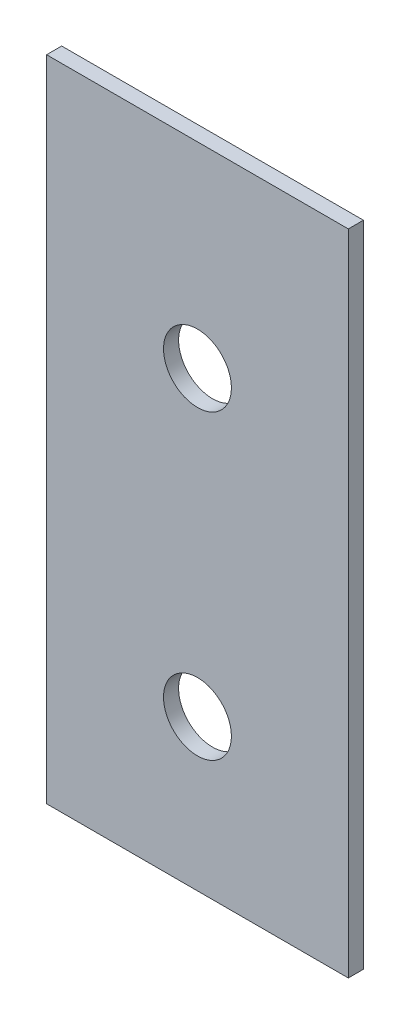
ISO-10303-21;
HEADER;
FILE_DESCRIPTION(('STEP AP214'),'2;1');
FILE_NAME('part.step','',(''),(''),'','','');
FILE_SCHEMA(('AUTOMOTIVE_DESIGN { 1 0 10303 214 1 1 1 1 }'));
ENDSEC;
DATA;
#1=APPLICATION_CONTEXT('core data for automotive mechanical design processes');
#2=APPLICATION_PROTOCOL_DEFINITION('international standard','automotive_design',2000,#1);
#3=PRODUCT_CONTEXT('',#1,'mechanical');
#4=PRODUCT('Part','Part','',(#3));
#5=PRODUCT_RELATED_PRODUCT_CATEGORY('part','',(#4));
#6=PRODUCT_DEFINITION_FORMATION('','',#4);
#7=PRODUCT_DEFINITION_CONTEXT('part definition',#1,'design');
#8=PRODUCT_DEFINITION('design','',#6,#7);
#9=PRODUCT_DEFINITION_SHAPE('','',#8);
#10=(LENGTH_UNIT() NAMED_UNIT(*) SI_UNIT(.MILLI.,.METRE.));
#11=(NAMED_UNIT(*) PLANE_ANGLE_UNIT() SI_UNIT($,.RADIAN.));
#12=(NAMED_UNIT(*) SI_UNIT($,.STERADIAN.) SOLID_ANGLE_UNIT());
#13=UNCERTAINTY_MEASURE_WITH_UNIT(LENGTH_MEASURE(1.E-05),#10,'distance_accuracy_value','');
#14=(GEOMETRIC_REPRESENTATION_CONTEXT(3) GLOBAL_UNCERTAINTY_ASSIGNED_CONTEXT((#13)) GLOBAL_UNIT_ASSIGNED_CONTEXT((#10,
#11,#12)) REPRESENTATION_CONTEXT('',''));
#15=CARTESIAN_POINT('',(0.,0.,0.));
#16=DIRECTION('',(0.,0.,1.));
#17=DIRECTION('',(1.,0.,0.));
#18=AXIS2_PLACEMENT_3D('',#15,#16,#17);
#19=CARTESIAN_POINT('',(6.900791049702E-11,-57.,21.98999999988));
#20=DIRECTION('',(-4.806710585115E-13,0.,-1.));
#21=DIRECTION('',(1.,0.,-4.806710585115E-13));
#22=AXIS2_PLACEMENT_3D('',#19,#20,#21);
#23=CYLINDRICAL_SURFACE('',#22,4.5);
#24=CARTESIAN_POINT('',(1.844000507845E-10,-57.,21.999999999639));
#25=DIRECTION('',(-4.806710585115E-13,0.,-1.));
#26=DIRECTION('',(1.,0.,-4.806710585115E-13));
#27=AXIS2_PLACEMENT_3D('',#24,#25,#26);
#28=CIRCLE('',#27,4.5);
#29=CARTESIAN_POINT('',(4.500000000194,-57.,21.999999999601));
#30=VERTEX_POINT('',#29);
#31=EDGE_CURVE('E80',#30,#30,#28,.T.);
#32=ORIENTED_EDGE('',*,*,#31,.T.);
#33=DIRECTION('',(4.806710585115E-13,0.,1.));
#34=VECTOR('',#33,1.);
#35=CARTESIAN_POINT('',(4.500000000078,-57.,21.989999999842));
#36=LINE('',#35,#34);
#37=CARTESIAN_POINT('',(4.50000000008,-57.,24.000000000007));
#38=VERTEX_POINT('',#37);
#39=EDGE_CURVE('E11',#30,#38,#36,.T.);
#40=ORIENTED_EDGE('',*,*,#39,.T.);
#41=CARTESIAN_POINT('',(7.04858393874E-11,-57.,24.000000000045));
#42=DIRECTION('',(-4.806710585115E-13,0.,-1.));
#43=DIRECTION('',(1.,0.,-4.806710585115E-13));
#44=AXIS2_PLACEMENT_3D('',#41,#42,#43);
#45=CIRCLE('',#44,4.5);
#46=EDGE_CURVE('E78',#38,#38,#45,.T.);
#47=ORIENTED_EDGE('',*,*,#46,.F.);
#48=ORIENTED_EDGE('',*,*,#39,.F.);
#49=EDGE_LOOP('',(#32,#40,#47,#48));
#50=FACE_BOUND('',#49,.T.);
#51=ADVANCED_FACE('F17',(#50),#23,.F.);
#52=CARTESIAN_POINT('',(6.900791049702E-11,-97.,21.98999999988));
#53=DIRECTION('',(-4.806710585115E-13,0.,-1.));
#54=DIRECTION('',(1.,0.,-4.806710585115E-13));
#55=AXIS2_PLACEMENT_3D('',#52,#53,#54);
#56=CYLINDRICAL_SURFACE('',#55,4.5);
#57=CARTESIAN_POINT('',(1.844000507845E-10,-97.,21.999999999639));
#58=DIRECTION('',(-4.806710585115E-13,0.,-1.));
#59=DIRECTION('',(1.,0.,-4.806710585115E-13));
#60=AXIS2_PLACEMENT_3D('',#57,#58,#59);
#61=CIRCLE('',#60,4.5);
#62=CARTESIAN_POINT('',(4.500000000194,-97.,21.999999999601));
#63=VERTEX_POINT('',#62);
#64=EDGE_CURVE('E102',#63,#63,#61,.T.);
#65=ORIENTED_EDGE('',*,*,#64,.T.);
#66=DIRECTION('',(4.806710585115E-13,0.,1.));
#67=VECTOR('',#66,1.);
#68=CARTESIAN_POINT('',(4.500000000078,-97.,21.989999999842));
#69=LINE('',#68,#67);
#70=CARTESIAN_POINT('',(4.50000000008,-97.,24.000000000007));
#71=VERTEX_POINT('',#70);
#72=EDGE_CURVE('E25',#63,#71,#69,.T.);
#73=ORIENTED_EDGE('',*,*,#72,.T.);
#74=CARTESIAN_POINT('',(7.04858393874E-11,-97.,24.000000000045));
#75=DIRECTION('',(-4.806710585115E-13,0.,-1.));
#76=DIRECTION('',(1.,0.,-4.806710585115E-13));
#77=AXIS2_PLACEMENT_3D('',#74,#75,#76);
#78=CIRCLE('',#77,4.5);
#79=EDGE_CURVE('E86',#71,#71,#78,.T.);
#80=ORIENTED_EDGE('',*,*,#79,.F.);
#81=ORIENTED_EDGE('',*,*,#72,.F.);
#82=EDGE_LOOP('',(#65,#73,#80,#81));
#83=FACE_BOUND('',#82,.T.);
#84=ADVANCED_FACE('F178',(#83),#56,.F.);
#85=CARTESIAN_POINT('',(20.000000000093,-117.,21.999999999666));
#86=DIRECTION('',(1.,0.,-4.806710585115E-13));
#87=DIRECTION('',(-4.806710585115E-13,0.,-1.));
#88=AXIS2_PLACEMENT_3D('',#85,#86,#87);
#89=PLANE('',#88);
#90=DIRECTION('',(4.806710585115E-13,0.,1.));
#91=VECTOR('',#90,1.);
#92=CARTESIAN_POINT('',(20.000000000093,-117.,21.999999999666));
#93=LINE('',#92,#91);
#94=CARTESIAN_POINT('',(20.000000000093,-117.,21.999999999666));
#95=VERTEX_POINT('',#94);
#96=CARTESIAN_POINT('',(20.000000000076,-117.,24.000000000098));
#97=VERTEX_POINT('',#96);
#98=EDGE_CURVE('E119',#95,#97,#93,.T.);
#99=ORIENTED_EDGE('',*,*,#98,.F.);
#100=DIRECTION('',(0.,1.,0.));
#101=VECTOR('',#100,1.);
#102=CARTESIAN_POINT('',(20.000000000093,-117.,21.999999999666));
#103=LINE('',#102,#101);
#104=CARTESIAN_POINT('',(20.000000000093,-31.,21.999999999666));
#105=VERTEX_POINT('',#104);
#106=EDGE_CURVE('E101',#95,#105,#103,.T.);
#107=ORIENTED_EDGE('',*,*,#106,.T.);
#108=DIRECTION('',(4.806710585115E-13,0.,1.));
#109=VECTOR('',#108,1.);
#110=CARTESIAN_POINT('',(20.000000000093,-31.,21.999999999666));
#111=LINE('',#110,#109);
#112=CARTESIAN_POINT('',(20.000000000076,-31.,24.000000000098));
#113=VERTEX_POINT('',#112);
#114=EDGE_CURVE('E92',#105,#113,#111,.T.);
#115=ORIENTED_EDGE('',*,*,#114,.T.);
#116=DIRECTION('',(0.,1.,0.));
#117=VECTOR('',#116,1.);
#118=CARTESIAN_POINT('',(20.000000000075,-117.,24.000000000098));
#119=LINE('',#118,#117);
#120=EDGE_CURVE('E115',#97,#113,#119,.T.);
#121=ORIENTED_EDGE('',*,*,#120,.F.);
#122=EDGE_LOOP('',(#99,#107,#115,#121));
#123=FACE_BOUND('',#122,.T.);
#124=ADVANCED_FACE('F147',(#123),#89,.T.);
#125=CARTESIAN_POINT('',(-19.99999999982,-117.,21.999999999585));
#126=DIRECTION('',(4.806710585115E-13,0.,1.));
#127=DIRECTION('',(1.,0.,-4.806710585115E-13));
#128=AXIS2_PLACEMENT_3D('',#125,#126,#127);
#129=PLANE('',#128);
#130=ORIENTED_EDGE('',*,*,#31,.F.);
#131=EDGE_LOOP('',(#130));
#132=FACE_BOUND('',#131,.T.);
#133=ORIENTED_EDGE('',*,*,#64,.F.);
#134=EDGE_LOOP('',(#133));
#135=FACE_BOUND('',#134,.T.);
#136=DIRECTION('',(1.,0.,-4.806710585115E-13));
#137=VECTOR('',#136,1.);
#138=CARTESIAN_POINT('',(-19.99999999982,-31.,21.999999999585));
#139=LINE('',#138,#137);
#140=CARTESIAN_POINT('',(-19.99999999982,-31.,21.999999999585));
#141=VERTEX_POINT('',#140);
#142=EDGE_CURVE('E85',#141,#105,#139,.T.);
#143=ORIENTED_EDGE('',*,*,#142,.T.);
#144=ORIENTED_EDGE('',*,*,#106,.F.);
#145=DIRECTION('',(1.,0.,-4.806710585115E-13));
#146=VECTOR('',#145,1.);
#147=CARTESIAN_POINT('',(-19.99999999982,-117.,21.999999999585));
#148=LINE('',#147,#146);
#149=CARTESIAN_POINT('',(-19.99999999982,-117.,21.999999999585));
#150=VERTEX_POINT('',#149);
#151=EDGE_CURVE('E118',#150,#95,#148,.T.);
#152=ORIENTED_EDGE('',*,*,#151,.F.);
#153=DIRECTION('',(0.,1.,0.));
#154=VECTOR('',#153,1.);
#155=CARTESIAN_POINT('',(-19.99999999982,-117.,21.999999999585));
#156=LINE('',#155,#154);
#157=EDGE_CURVE('E158',#150,#141,#156,.T.);
#158=ORIENTED_EDGE('',*,*,#157,.T.);
#159=EDGE_LOOP('',(#143,#144,#152,#158));
#160=FACE_BOUND('',#159,.T.);
#161=ADVANCED_FACE('F149',(#132,#135,#160),#129,.F.);
#162=CARTESIAN_POINT('',(-19.99999999982,-31.,21.999999999585));
#163=DIRECTION('',(0.,1.,0.));
#164=DIRECTION('',(1.,0.,0.));
#165=AXIS2_PLACEMENT_3D('',#162,#163,#164);
#166=PLANE('',#165);
#167=ORIENTED_EDGE('',*,*,#142,.F.);
#168=DIRECTION('',(4.806710585115E-13,0.,1.));
#169=VECTOR('',#168,1.);
#170=CARTESIAN_POINT('',(-19.99999999982,-31.,21.999999999585));
#171=LINE('',#170,#169);
#172=CARTESIAN_POINT('',(-19.99999999993,-31.,23.99999999999));
#173=VERTEX_POINT('',#172);
#174=EDGE_CURVE('E140',#141,#173,#171,.T.);
#175=ORIENTED_EDGE('',*,*,#174,.T.);
#176=DIRECTION('',(1.,0.,-4.806710585115E-13));
#177=VECTOR('',#176,1.);
#178=CARTESIAN_POINT('',(-19.99999999993,-31.,23.999999999991));
#179=LINE('',#178,#177);
#180=EDGE_CURVE('E96',#173,#113,#179,.T.);
#181=ORIENTED_EDGE('',*,*,#180,.T.);
#182=ORIENTED_EDGE('',*,*,#114,.F.);
#183=EDGE_LOOP('',(#167,#175,#181,#182));
#184=FACE_BOUND('',#183,.T.);
#185=ADVANCED_FACE('F138',(#184),#166,.T.);
#186=CARTESIAN_POINT('',(-19.99999999993,-117.,23.999999999991));
#187=DIRECTION('',(4.806710585115E-13,0.,1.));
#188=DIRECTION('',(1.,0.,-4.806710585115E-13));
#189=AXIS2_PLACEMENT_3D('',#186,#187,#188);
#190=PLANE('',#189);
#191=ORIENTED_EDGE('',*,*,#46,.T.);
#192=EDGE_LOOP('',(#191));
#193=FACE_BOUND('',#192,.T.);
#194=ORIENTED_EDGE('',*,*,#79,.T.);
#195=EDGE_LOOP('',(#194));
#196=FACE_BOUND('',#195,.T.);
#197=DIRECTION('',(0.,1.,0.));
#198=VECTOR('',#197,1.);
#199=CARTESIAN_POINT('',(-19.99999999993,-117.,23.999999999991));
#200=LINE('',#199,#198);
#201=CARTESIAN_POINT('',(-19.99999999993,-117.,23.99999999999));
#202=VERTEX_POINT('',#201);
#203=EDGE_CURVE('E163',#202,#173,#200,.T.);
#204=ORIENTED_EDGE('',*,*,#203,.F.);
#205=DIRECTION('',(1.,0.,-4.806710585115E-13));
#206=VECTOR('',#205,1.);
#207=CARTESIAN_POINT('',(-19.99999999993,-117.,23.999999999991));
#208=LINE('',#207,#206);
#209=EDGE_CURVE('E123',#202,#97,#208,.T.);
#210=ORIENTED_EDGE('',*,*,#209,.T.);
#211=ORIENTED_EDGE('',*,*,#120,.T.);
#212=ORIENTED_EDGE('',*,*,#180,.F.);
#213=EDGE_LOOP('',(#204,#210,#211,#212));
#214=FACE_BOUND('',#213,.T.);
#215=ADVANCED_FACE('F82',(#193,#196,#214),#190,.T.);
#216=CARTESIAN_POINT('',(-19.99999999982,-117.,21.999999999585));
#217=DIRECTION('',(0.,1.,0.));
#218=DIRECTION('',(1.,0.,0.));
#219=AXIS2_PLACEMENT_3D('',#216,#217,#218);
#220=PLANE('',#219);
#221=ORIENTED_EDGE('',*,*,#98,.T.);
#222=ORIENTED_EDGE('',*,*,#209,.F.);
#223=DIRECTION('',(4.806710585115E-13,0.,1.));
#224=VECTOR('',#223,1.);
#225=CARTESIAN_POINT('',(-19.99999999982,-117.,21.999999999585));
#226=LINE('',#225,#224);
#227=EDGE_CURVE('E113',#150,#202,#226,.T.);
#228=ORIENTED_EDGE('',*,*,#227,.F.);
#229=ORIENTED_EDGE('',*,*,#151,.T.);
#230=EDGE_LOOP('',(#221,#222,#228,#229));
#231=FACE_BOUND('',#230,.T.);
#232=ADVANCED_FACE('F153',(#231),#220,.F.);
#233=CARTESIAN_POINT('',(-19.99999999982,-117.,21.999999999585));
#234=DIRECTION('',(1.,0.,-4.806710585115E-13));
#235=DIRECTION('',(-4.806710585115E-13,0.,-1.));
#236=AXIS2_PLACEMENT_3D('',#233,#234,#235);
#237=PLANE('',#236);
#238=ORIENTED_EDGE('',*,*,#203,.T.);
#239=ORIENTED_EDGE('',*,*,#174,.F.);
#240=ORIENTED_EDGE('',*,*,#157,.F.);
#241=ORIENTED_EDGE('',*,*,#227,.T.);
#242=EDGE_LOOP('',(#238,#239,#240,#241));
#243=FACE_BOUND('',#242,.T.);
#244=ADVANCED_FACE('F159',(#243),#237,.F.);
#245=CLOSED_SHELL('',(#51,#84,#124,#161,#185,#215,#232,#244));
#246=MANIFOLD_SOLID_BREP('B1',#245);
#247=ADVANCED_BREP_SHAPE_REPRESENTATION('',(#18,#246),#14);
#248=SHAPE_DEFINITION_REPRESENTATION(#9,#247);
ENDSEC;
END-ISO-10303-21;
